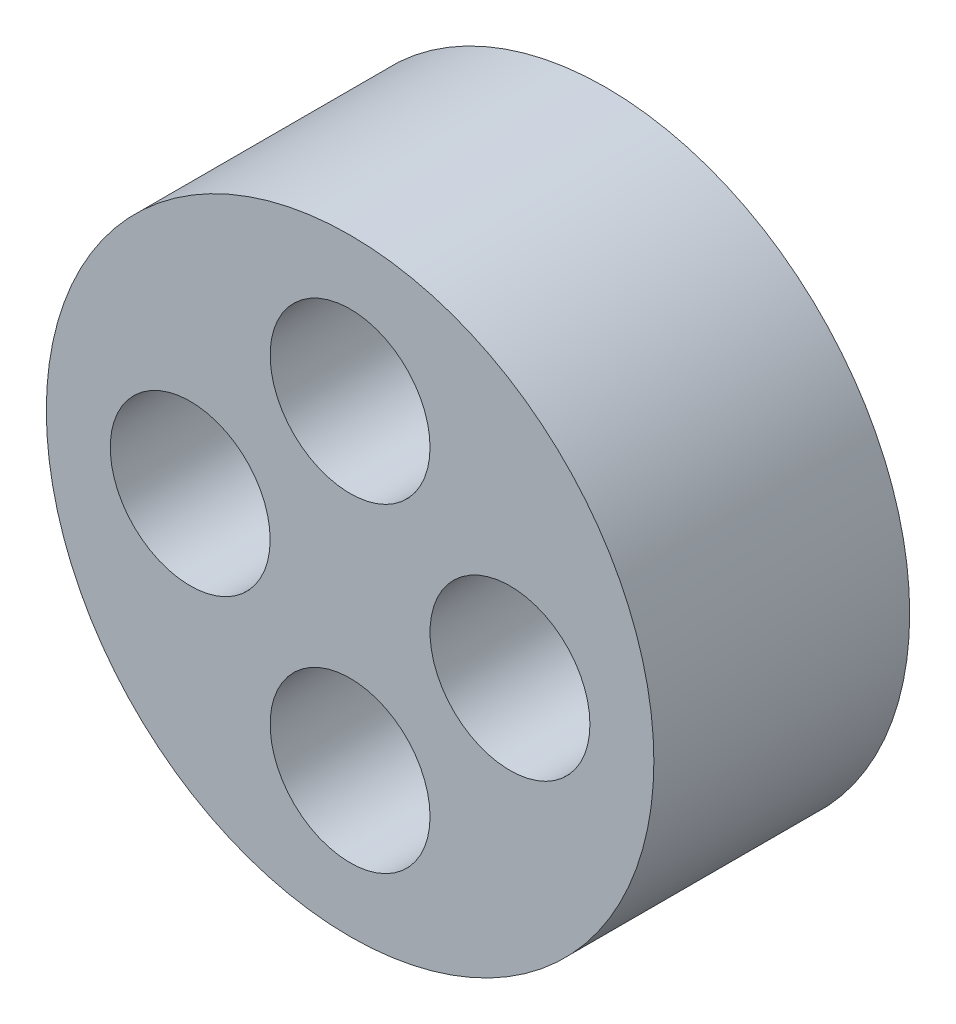
ISO-10303-21;
HEADER;
FILE_DESCRIPTION(('STEP AP214'),'2;1');
FILE_NAME('part.step','',(''),(''),'','','');
FILE_SCHEMA(('AUTOMOTIVE_DESIGN { 1 0 10303 214 1 1 1 1 }'));
ENDSEC;
DATA;
#1=APPLICATION_CONTEXT('core data for automotive mechanical design processes');
#2=APPLICATION_PROTOCOL_DEFINITION('international standard','automotive_design',2000,#1);
#3=PRODUCT_CONTEXT('',#1,'mechanical');
#4=PRODUCT('Part','Part','',(#3));
#5=PRODUCT_RELATED_PRODUCT_CATEGORY('part','',(#4));
#6=PRODUCT_DEFINITION_FORMATION('','',#4);
#7=PRODUCT_DEFINITION_CONTEXT('part definition',#1,'design');
#8=PRODUCT_DEFINITION('design','',#6,#7);
#9=PRODUCT_DEFINITION_SHAPE('','',#8);
#10=(LENGTH_UNIT() NAMED_UNIT(*) SI_UNIT(.MILLI.,.METRE.));
#11=(NAMED_UNIT(*) PLANE_ANGLE_UNIT() SI_UNIT($,.RADIAN.));
#12=(NAMED_UNIT(*) SI_UNIT($,.STERADIAN.) SOLID_ANGLE_UNIT());
#13=UNCERTAINTY_MEASURE_WITH_UNIT(LENGTH_MEASURE(1.E-05),#10,'distance_accuracy_value','');
#14=(GEOMETRIC_REPRESENTATION_CONTEXT(3) GLOBAL_UNCERTAINTY_ASSIGNED_CONTEXT((#13)) GLOBAL_UNIT_ASSIGNED_CONTEXT((#10,
#11,#12)) REPRESENTATION_CONTEXT('',''));
#15=CARTESIAN_POINT('',(0.,0.,0.));
#16=DIRECTION('',(0.,0.,1.));
#17=DIRECTION('',(1.,0.,0.));
#18=AXIS2_PLACEMENT_3D('',#15,#16,#17);
#19=CARTESIAN_POINT('',(1.4119006205266E-13,-2.5,4.));
#20=DIRECTION('',(0.,0.,-1.));
#21=DIRECTION('',(-1.,0.,0.));
#22=AXIS2_PLACEMENT_3D('',#19,#20,#21);
#23=CYLINDRICAL_SURFACE('',#22,1.25000000000015);
#24=CARTESIAN_POINT('',(1.4119006205266E-13,-2.5,4.));
#25=DIRECTION('',(0.,0.,1.));
#26=DIRECTION('',(1.,0.,0.));
#27=AXIS2_PLACEMENT_3D('',#24,#25,#26);
#28=CIRCLE('',#27,1.25000000000015);
#29=CARTESIAN_POINT('',(1.25000000000029,-2.5,4.));
#30=VERTEX_POINT('',#29);
#31=EDGE_CURVE('E45',#30,#30,#28,.T.);
#32=ORIENTED_EDGE('',*,*,#31,.T.);
#33=EDGE_LOOP('',(#32));
#34=FACE_BOUND('',#33,.T.);
#35=CARTESIAN_POINT('',(1.4119006205266E-13,-2.5,0.));
#36=DIRECTION('',(0.,0.,1.));
#37=DIRECTION('',(1.,0.,0.));
#38=AXIS2_PLACEMENT_3D('',#35,#36,#37);
#39=CIRCLE('',#38,1.25000000000015);
#40=CARTESIAN_POINT('',(1.25000000000029,-2.5,0.));
#41=VERTEX_POINT('',#40);
#42=EDGE_CURVE('E62',#41,#41,#39,.T.);
#43=ORIENTED_EDGE('',*,*,#42,.F.);
#44=EDGE_LOOP('',(#43));
#45=FACE_BOUND('',#44,.T.);
#46=ADVANCED_FACE('F37',(#34,#45),#23,.F.);
#47=CARTESIAN_POINT('',(2.50000000000007,0.,4.));
#48=DIRECTION('',(0.,0.,-1.));
#49=DIRECTION('',(-1.,0.,0.));
#50=AXIS2_PLACEMENT_3D('',#47,#48,#49);
#51=CYLINDRICAL_SURFACE('',#50,1.25000000000006);
#52=CARTESIAN_POINT('',(2.50000000000007,0.,4.));
#53=DIRECTION('',(0.,0.,1.));
#54=DIRECTION('',(1.,0.,0.));
#55=AXIS2_PLACEMENT_3D('',#52,#53,#54);
#56=CIRCLE('',#55,1.25000000000006);
#57=CARTESIAN_POINT('',(3.75000000000013,0.,4.));
#58=VERTEX_POINT('',#57);
#59=EDGE_CURVE('E50',#58,#58,#56,.T.);
#60=ORIENTED_EDGE('',*,*,#59,.T.);
#61=EDGE_LOOP('',(#60));
#62=FACE_BOUND('',#61,.T.);
#63=CARTESIAN_POINT('',(2.50000000000007,0.,0.));
#64=DIRECTION('',(0.,0.,1.));
#65=DIRECTION('',(1.,0.,0.));
#66=AXIS2_PLACEMENT_3D('',#63,#64,#65);
#67=CIRCLE('',#66,1.25000000000006);
#68=CARTESIAN_POINT('',(3.75000000000013,0.,0.));
#69=VERTEX_POINT('',#68);
#70=EDGE_CURVE('E60',#69,#69,#67,.T.);
#71=ORIENTED_EDGE('',*,*,#70,.F.);
#72=EDGE_LOOP('',(#71));
#73=FACE_BOUND('',#72,.T.);
#74=ADVANCED_FACE('F80',(#62,#73),#51,.F.);
#75=CARTESIAN_POINT('',(0.,2.5,4.));
#76=DIRECTION('',(0.,0.,-1.));
#77=DIRECTION('',(-1.,0.,0.));
#78=AXIS2_PLACEMENT_3D('',#75,#76,#77);
#79=CYLINDRICAL_SURFACE('',#78,1.25);
#80=CARTESIAN_POINT('',(0.,2.5,4.));
#81=DIRECTION('',(0.,0.,1.));
#82=DIRECTION('',(1.,0.,0.));
#83=AXIS2_PLACEMENT_3D('',#80,#81,#82);
#84=CIRCLE('',#83,1.25);
#85=CARTESIAN_POINT('',(1.25,2.5,4.));
#86=VERTEX_POINT('',#85);
#87=EDGE_CURVE('E71',#86,#86,#84,.T.);
#88=ORIENTED_EDGE('',*,*,#87,.T.);
#89=EDGE_LOOP('',(#88));
#90=FACE_BOUND('',#89,.T.);
#91=CARTESIAN_POINT('',(0.,2.5,0.));
#92=DIRECTION('',(0.,0.,1.));
#93=DIRECTION('',(1.,0.,0.));
#94=AXIS2_PLACEMENT_3D('',#91,#92,#93);
#95=CIRCLE('',#94,1.25);
#96=CARTESIAN_POINT('',(1.25,2.5,0.));
#97=VERTEX_POINT('',#96);
#98=EDGE_CURVE('E57',#97,#97,#95,.T.);
#99=ORIENTED_EDGE('',*,*,#98,.F.);
#100=EDGE_LOOP('',(#99));
#101=FACE_BOUND('',#100,.T.);
#102=ADVANCED_FACE('F98',(#90,#101),#79,.F.);
#103=CARTESIAN_POINT('',(-2.49999999999993,0.,4.));
#104=DIRECTION('',(0.,0.,-1.));
#105=DIRECTION('',(-1.,0.,0.));
#106=AXIS2_PLACEMENT_3D('',#103,#104,#105);
#107=CYLINDRICAL_SURFACE('',#106,1.25000000000011);
#108=CARTESIAN_POINT('',(-2.49999999999993,0.,4.));
#109=DIRECTION('',(0.,0.,1.));
#110=DIRECTION('',(1.,0.,0.));
#111=AXIS2_PLACEMENT_3D('',#108,#109,#110);
#112=CIRCLE('',#111,1.25000000000011);
#113=CARTESIAN_POINT('',(-1.24999999999982,0.,4.));
#114=VERTEX_POINT('',#113);
#115=EDGE_CURVE('E67',#114,#114,#112,.T.);
#116=ORIENTED_EDGE('',*,*,#115,.T.);
#117=EDGE_LOOP('',(#116));
#118=FACE_BOUND('',#117,.T.);
#119=CARTESIAN_POINT('',(-2.49999999999993,0.,0.));
#120=DIRECTION('',(0.,0.,1.));
#121=DIRECTION('',(1.,0.,0.));
#122=AXIS2_PLACEMENT_3D('',#119,#120,#121);
#123=CIRCLE('',#122,1.25000000000011);
#124=CARTESIAN_POINT('',(-1.24999999999982,0.,0.));
#125=VERTEX_POINT('',#124);
#126=EDGE_CURVE('E54',#125,#125,#123,.T.);
#127=ORIENTED_EDGE('',*,*,#126,.F.);
#128=EDGE_LOOP('',(#127));
#129=FACE_BOUND('',#128,.T.);
#130=ADVANCED_FACE('F39',(#118,#129),#107,.F.);
#131=CARTESIAN_POINT('',(0.,0.,4.));
#132=DIRECTION('',(0.,0.,-1.));
#133=DIRECTION('',(-1.,0.,0.));
#134=AXIS2_PLACEMENT_3D('',#131,#132,#133);
#135=CYLINDRICAL_SURFACE('',#134,4.75);
#136=CARTESIAN_POINT('',(0.,0.,4.));
#137=DIRECTION('',(0.,0.,1.));
#138=DIRECTION('',(1.,0.,0.));
#139=AXIS2_PLACEMENT_3D('',#136,#137,#138);
#140=CIRCLE('',#139,4.75);
#141=CARTESIAN_POINT('',(4.75,0.,4.));
#142=VERTEX_POINT('',#141);
#143=EDGE_CURVE('E10',#142,#142,#140,.T.);
#144=ORIENTED_EDGE('',*,*,#143,.F.);
#145=EDGE_LOOP('',(#144));
#146=FACE_BOUND('',#145,.T.);
#147=CARTESIAN_POINT('',(0.,0.,0.));
#148=DIRECTION('',(0.,0.,1.));
#149=DIRECTION('',(1.,0.,0.));
#150=AXIS2_PLACEMENT_3D('',#147,#148,#149);
#151=CIRCLE('',#150,4.75);
#152=CARTESIAN_POINT('',(4.75,0.,0.));
#153=VERTEX_POINT('',#152);
#154=EDGE_CURVE('E41',#153,#153,#151,.T.);
#155=ORIENTED_EDGE('',*,*,#154,.T.);
#156=EDGE_LOOP('',(#155));
#157=FACE_BOUND('',#156,.T.);
#158=ADVANCED_FACE('F87',(#146,#157),#135,.T.);
#159=CARTESIAN_POINT('',(0.,0.,4.));
#160=DIRECTION('',(0.,0.,1.));
#161=DIRECTION('',(1.,0.,0.));
#162=AXIS2_PLACEMENT_3D('',#159,#160,#161);
#163=PLANE('',#162);
#164=ORIENTED_EDGE('',*,*,#115,.F.);
#165=EDGE_LOOP('',(#164));
#166=FACE_BOUND('',#165,.T.);
#167=ORIENTED_EDGE('',*,*,#87,.F.);
#168=EDGE_LOOP('',(#167));
#169=FACE_BOUND('',#168,.T.);
#170=ORIENTED_EDGE('',*,*,#59,.F.);
#171=EDGE_LOOP('',(#170));
#172=FACE_BOUND('',#171,.T.);
#173=ORIENTED_EDGE('',*,*,#31,.F.);
#174=EDGE_LOOP('',(#173));
#175=FACE_BOUND('',#174,.T.);
#176=ORIENTED_EDGE('',*,*,#143,.T.);
#177=EDGE_LOOP('',(#176));
#178=FACE_BOUND('',#177,.T.);
#179=ADVANCED_FACE('F83',(#166,#169,#172,#175,#178),#163,.T.);
#180=CARTESIAN_POINT('',(0.,0.,0.));
#181=DIRECTION('',(0.,0.,1.));
#182=DIRECTION('',(1.,0.,0.));
#183=AXIS2_PLACEMENT_3D('',#180,#181,#182);
#184=PLANE('',#183);
#185=ORIENTED_EDGE('',*,*,#126,.T.);
#186=EDGE_LOOP('',(#185));
#187=FACE_BOUND('',#186,.T.);
#188=ORIENTED_EDGE('',*,*,#98,.T.);
#189=EDGE_LOOP('',(#188));
#190=FACE_BOUND('',#189,.T.);
#191=ORIENTED_EDGE('',*,*,#70,.T.);
#192=EDGE_LOOP('',(#191));
#193=FACE_BOUND('',#192,.T.);
#194=ORIENTED_EDGE('',*,*,#42,.T.);
#195=EDGE_LOOP('',(#194));
#196=FACE_BOUND('',#195,.T.);
#197=ORIENTED_EDGE('',*,*,#154,.F.);
#198=EDGE_LOOP('',(#197));
#199=FACE_BOUND('',#198,.T.);
#200=ADVANCED_FACE('F86',(#187,#190,#193,#196,#199),#184,.F.);
#201=CLOSED_SHELL('',(#46,#74,#102,#130,#158,#179,#200));
#202=MANIFOLD_SOLID_BREP('B2',#201);
#203=ADVANCED_BREP_SHAPE_REPRESENTATION('',(#18,#202),#14);
#204=SHAPE_DEFINITION_REPRESENTATION(#9,#203);
ENDSEC;
END-ISO-10303-21;
